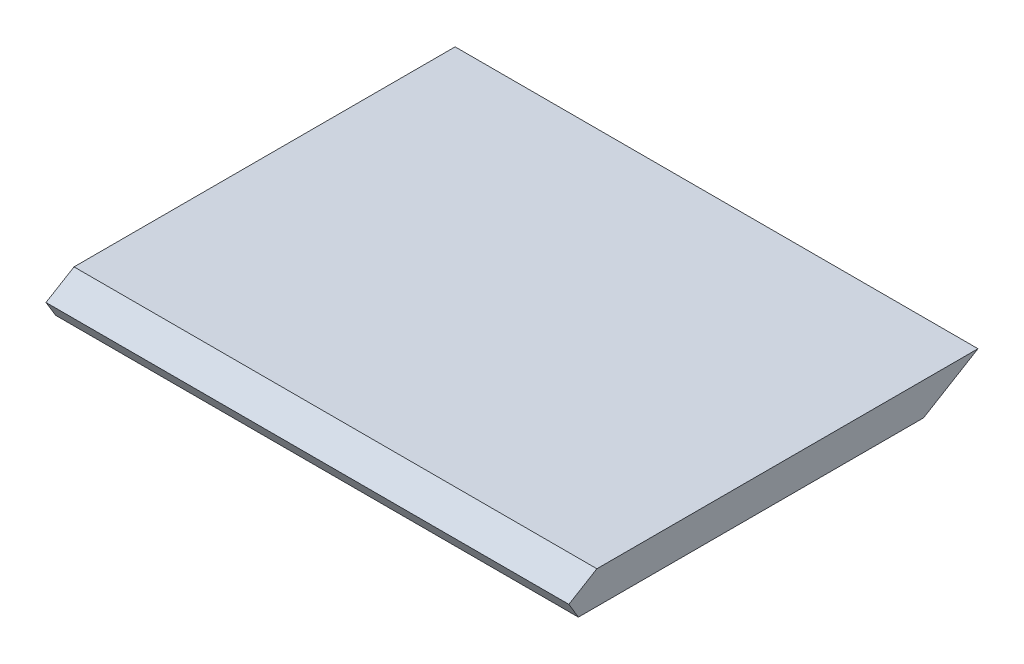
ISO-10303-21;
HEADER;
FILE_DESCRIPTION(('STEP AP214'),'2;1');
FILE_NAME('part.step','',(''),(''),'','','');
FILE_SCHEMA(('AUTOMOTIVE_DESIGN { 1 0 10303 214 1 1 1 1 }'));
ENDSEC;
DATA;
#1=APPLICATION_CONTEXT('core data for automotive mechanical design processes');
#2=APPLICATION_PROTOCOL_DEFINITION('international standard','automotive_design',2000,#1);
#3=PRODUCT_CONTEXT('',#1,'mechanical');
#4=PRODUCT('Part','Part','',(#3));
#5=PRODUCT_RELATED_PRODUCT_CATEGORY('part','',(#4));
#6=PRODUCT_DEFINITION_FORMATION('','',#4);
#7=PRODUCT_DEFINITION_CONTEXT('part definition',#1,'design');
#8=PRODUCT_DEFINITION('design','',#6,#7);
#9=PRODUCT_DEFINITION_SHAPE('','',#8);
#10=(LENGTH_UNIT() NAMED_UNIT(*) SI_UNIT(.MILLI.,.METRE.));
#11=(NAMED_UNIT(*) PLANE_ANGLE_UNIT() SI_UNIT($,.RADIAN.));
#12=(NAMED_UNIT(*) SI_UNIT($,.STERADIAN.) SOLID_ANGLE_UNIT());
#13=UNCERTAINTY_MEASURE_WITH_UNIT(LENGTH_MEASURE(1.E-05),#10,'distance_accuracy_value','');
#14=(GEOMETRIC_REPRESENTATION_CONTEXT(3) GLOBAL_UNCERTAINTY_ASSIGNED_CONTEXT((#13)) GLOBAL_UNIT_ASSIGNED_CONTEXT((#10,
#11,#12)) REPRESENTATION_CONTEXT('',''));
#15=CARTESIAN_POINT('',(0.,0.,0.));
#16=DIRECTION('',(0.,0.,1.));
#17=DIRECTION('',(1.,0.,0.));
#18=AXIS2_PLACEMENT_3D('',#15,#16,#17);
#19=CARTESIAN_POINT('',(-110.158089777708,6.34999999999941,17.0851304363685));
#20=DIRECTION('',(0.,1.,0.));
#21=DIRECTION('',(0.,0.,1.));
#22=AXIS2_PLACEMENT_3D('',#19,#20,#21);
#23=PLANE('',#22);
#24=DIRECTION('',(0.,0.,-1.));
#25=VECTOR('',#24,1.);
#26=CARTESIAN_POINT('',(-30.4067173941634,6.34999999999941,17.0851304363685));
#27=LINE('',#26,#25);
#28=CARTESIAN_POINT('',(-30.4067173941634,6.34999999999941,17.0851304363685));
#29=VERTEX_POINT('',#28);
#30=CARTESIAN_POINT('',(-30.4067173941634,6.34999999999936,-56.9679586281669));
#31=VERTEX_POINT('',#30);
#32=EDGE_CURVE('E42',#29,#31,#27,.T.);
#33=ORIENTED_EDGE('',*,*,#32,.F.);
#34=DIRECTION('',(1.,0.,0.));
#35=VECTOR('',#34,1.);
#36=CARTESIAN_POINT('',(-110.158089777708,6.34999999999941,17.0851304363685));
#37=LINE('',#36,#35);
#38=CARTESIAN_POINT('',(71.1932826058366,6.34999999999941,17.0851304363685));
#39=VERTEX_POINT('',#38);
#40=EDGE_CURVE('E75',#29,#39,#37,.T.);
#41=ORIENTED_EDGE('',*,*,#40,.T.);
#42=DIRECTION('',(0.,0.,1.));
#43=VECTOR('',#42,1.);
#44=CARTESIAN_POINT('',(71.1932826058366,6.34999999999941,17.0851304363685));
#45=LINE('',#44,#43);
#46=CARTESIAN_POINT('',(71.1932826058366,6.34999999999936,-56.9679586281669));
#47=VERTEX_POINT('',#46);
#48=EDGE_CURVE('E79',#47,#39,#45,.T.);
#49=ORIENTED_EDGE('',*,*,#48,.F.);
#50=DIRECTION('',(1.,0.,0.));
#51=VECTOR('',#50,1.);
#52=CARTESIAN_POINT('',(-110.158089777708,6.34999999999936,-56.9679586281669));
#53=LINE('',#52,#51);
#54=EDGE_CURVE('E106',#31,#47,#53,.T.);
#55=ORIENTED_EDGE('',*,*,#54,.F.);
#56=EDGE_LOOP('',(#33,#41,#49,#55));
#57=FACE_BOUND('',#56,.T.);
#58=ADVANCED_FACE('F34',(#57),#23,.T.);
#59=CARTESIAN_POINT('',(-110.158089777708,6.34999999999936,-56.9679586281669));
#60=DIRECTION('',(0.,-0.857492925712544,-0.514495755427527));
#61=DIRECTION('',(0.,0.514495755427527,-0.857492925712544));
#62=AXIS2_PLACEMENT_3D('',#59,#60,#61);
#63=PLANE('',#62);
#64=DIRECTION('',(0.,-0.514495755427527,0.857492925712544));
#65=VECTOR('',#64,1.);
#66=CARTESIAN_POINT('',(-30.4067173941634,6.34999999999936,-56.9679586281669));
#67=LINE('',#66,#65);
#68=CARTESIAN_POINT('',(-30.4067173941634,0.,-46.3846252948346));
#69=VERTEX_POINT('',#68);
#70=EDGE_CURVE('E123',#31,#69,#67,.T.);
#71=ORIENTED_EDGE('',*,*,#70,.F.);
#72=ORIENTED_EDGE('',*,*,#54,.T.);
#73=DIRECTION('',(0.,0.514495755427527,-0.857492925712544));
#74=VECTOR('',#73,1.);
#75=CARTESIAN_POINT('',(71.1932826058366,6.34999999999936,-56.9679586281669));
#76=LINE('',#75,#74);
#77=CARTESIAN_POINT('',(71.1932826058366,0.,-46.3846252948346));
#78=VERTEX_POINT('',#77);
#79=EDGE_CURVE('E85',#78,#47,#76,.T.);
#80=ORIENTED_EDGE('',*,*,#79,.F.);
#81=DIRECTION('',(1.,0.,0.));
#82=VECTOR('',#81,1.);
#83=CARTESIAN_POINT('',(-110.158089777708,0.,-46.3846252948346));
#84=LINE('',#83,#82);
#85=EDGE_CURVE('E109',#69,#78,#84,.T.);
#86=ORIENTED_EDGE('',*,*,#85,.F.);
#87=EDGE_LOOP('',(#71,#72,#80,#86));
#88=FACE_BOUND('',#87,.T.);
#89=ADVANCED_FACE('F122',(#88),#63,.T.);
#90=CARTESIAN_POINT('',(-110.158089777708,0.,-46.3846252948346));
#91=DIRECTION('',(0.,-1.,0.));
#92=DIRECTION('',(0.,0.,-1.));
#93=AXIS2_PLACEMENT_3D('',#90,#91,#92);
#94=PLANE('',#93);
#95=DIRECTION('',(0.,0.,1.));
#96=VECTOR('',#95,1.);
#97=CARTESIAN_POINT('',(-30.4067173941634,0.,-46.3846252948346));
#98=LINE('',#97,#96);
#99=CARTESIAN_POINT('',(-30.4067173941634,0.,20.6804393428224));
#100=VERTEX_POINT('',#99);
#101=EDGE_CURVE('E49',#69,#100,#98,.T.);
#102=ORIENTED_EDGE('',*,*,#101,.F.);
#103=ORIENTED_EDGE('',*,*,#85,.T.);
#104=DIRECTION('',(0.,0.,-1.));
#105=VECTOR('',#104,1.);
#106=CARTESIAN_POINT('',(71.1932826058366,0.,-46.3846252948346));
#107=LINE('',#106,#105);
#108=CARTESIAN_POINT('',(71.1932826058366,0.,20.6804393428224));
#109=VERTEX_POINT('',#108);
#110=EDGE_CURVE('E103',#109,#78,#107,.T.);
#111=ORIENTED_EDGE('',*,*,#110,.F.);
#112=DIRECTION('',(1.,0.,0.));
#113=VECTOR('',#112,1.);
#114=CARTESIAN_POINT('',(-110.158089777708,0.,20.6804393428224));
#115=LINE('',#114,#113);
#116=EDGE_CURVE('E111',#100,#109,#115,.T.);
#117=ORIENTED_EDGE('',*,*,#116,.F.);
#118=EDGE_LOOP('',(#102,#103,#111,#117));
#119=FACE_BOUND('',#118,.T.);
#120=ADVANCED_FACE('F118',(#119),#94,.T.);
#121=CARTESIAN_POINT('',(-110.158089777708,0.,20.6804393428224));
#122=DIRECTION('',(0.,-0.514495755427525,0.857492925712545));
#123=DIRECTION('',(0.,-0.857492925712545,-0.514495755427525));
#124=AXIS2_PLACEMENT_3D('',#121,#122,#123);
#125=PLANE('',#124);
#126=DIRECTION('',(0.,0.857492925712545,0.514495755427525));
#127=VECTOR('',#126,1.);
#128=CARTESIAN_POINT('',(-30.4067173941634,0.,20.6804393428224));
#129=LINE('',#128,#127);
#130=CARTESIAN_POINT('',(-30.4067173941634,3.08295195303463,22.5302105146432));
#131=VERTEX_POINT('',#130);
#132=EDGE_CURVE('E108',#100,#131,#129,.T.);
#133=ORIENTED_EDGE('',*,*,#132,.F.);
#134=ORIENTED_EDGE('',*,*,#116,.T.);
#135=DIRECTION('',(0.,-0.857492925712545,-0.514495755427525));
#136=VECTOR('',#135,1.);
#137=CARTESIAN_POINT('',(71.1932826058366,0.,20.6804393428224));
#138=LINE('',#137,#136);
#139=CARTESIAN_POINT('',(71.1932826058366,3.08295195303463,22.5302105146432));
#140=VERTEX_POINT('',#139);
#141=EDGE_CURVE('E93',#140,#109,#138,.T.);
#142=ORIENTED_EDGE('',*,*,#141,.F.);
#143=DIRECTION('',(1.,0.,0.));
#144=VECTOR('',#143,1.);
#145=CARTESIAN_POINT('',(-110.158089777708,3.08295195303463,22.5302105146432));
#146=LINE('',#145,#144);
#147=EDGE_CURVE('E84',#131,#140,#146,.T.);
#148=ORIENTED_EDGE('',*,*,#147,.F.);
#149=EDGE_LOOP('',(#133,#134,#142,#148));
#150=FACE_BOUND('',#149,.T.);
#151=ADVANCED_FACE('F116',(#150),#125,.T.);
#152=CARTESIAN_POINT('',(-110.158089777708,3.08295195303463,22.5302105146432));
#153=DIRECTION('',(0.,0.857492925712544,0.514495755427526));
#154=DIRECTION('',(0.,-0.514495755427526,0.857492925712544));
#155=AXIS2_PLACEMENT_3D('',#152,#153,#154);
#156=PLANE('',#155);
#157=DIRECTION('',(0.,0.514495755427526,-0.857492925712544));
#158=VECTOR('',#157,1.);
#159=CARTESIAN_POINT('',(-30.4067173941634,3.08295195303463,22.5302105146432));
#160=LINE('',#159,#158);
#161=EDGE_CURVE('E11',#131,#29,#160,.T.);
#162=ORIENTED_EDGE('',*,*,#161,.F.);
#163=ORIENTED_EDGE('',*,*,#147,.T.);
#164=DIRECTION('',(0.,-0.514495755427526,0.857492925712544));
#165=VECTOR('',#164,1.);
#166=CARTESIAN_POINT('',(71.1932826058366,3.08295195303463,22.5302105146432));
#167=LINE('',#166,#165);
#168=EDGE_CURVE('E87',#39,#140,#167,.T.);
#169=ORIENTED_EDGE('',*,*,#168,.F.);
#170=ORIENTED_EDGE('',*,*,#40,.F.);
#171=EDGE_LOOP('',(#162,#163,#169,#170));
#172=FACE_BOUND('',#171,.T.);
#173=ADVANCED_FACE('F88',(#172),#156,.T.);
#174=CARTESIAN_POINT('',(71.1932826058366,0.,0.));
#175=DIRECTION('',(1.,0.,0.));
#176=DIRECTION('',(0.,0.,-1.));
#177=AXIS2_PLACEMENT_3D('',#174,#175,#176);
#178=PLANE('',#177);
#179=ORIENTED_EDGE('',*,*,#48,.T.);
#180=ORIENTED_EDGE('',*,*,#168,.T.);
#181=ORIENTED_EDGE('',*,*,#141,.T.);
#182=ORIENTED_EDGE('',*,*,#110,.T.);
#183=ORIENTED_EDGE('',*,*,#79,.T.);
#184=EDGE_LOOP('',(#179,#180,#181,#182,#183));
#185=FACE_BOUND('',#184,.T.);
#186=ADVANCED_FACE('F95',(#185),#178,.T.);
#187=CARTESIAN_POINT('',(-30.4067173941634,348.301028915648,222.255747785757));
#188=DIRECTION('',(1.,0.,0.));
#189=DIRECTION('',(0.,-0.857492925712545,-0.514495755427526));
#190=AXIS2_PLACEMENT_3D('',#187,#188,#189);
#191=PLANE('',#190);
#192=ORIENTED_EDGE('',*,*,#32,.T.);
#193=ORIENTED_EDGE('',*,*,#70,.T.);
#194=ORIENTED_EDGE('',*,*,#101,.T.);
#195=ORIENTED_EDGE('',*,*,#132,.T.);
#196=ORIENTED_EDGE('',*,*,#161,.T.);
#197=EDGE_LOOP('',(#192,#193,#194,#195,#196));
#198=FACE_BOUND('',#197,.T.);
#199=ADVANCED_FACE('F124',(#198),#191,.F.);
#200=CLOSED_SHELL('',(#58,#89,#120,#151,#173,#186,#199));
#201=MANIFOLD_SOLID_BREP('B2',#200);
#202=ADVANCED_BREP_SHAPE_REPRESENTATION('',(#18,#201),#14);
#203=SHAPE_DEFINITION_REPRESENTATION(#9,#202);
ENDSEC;
END-ISO-10303-21;
